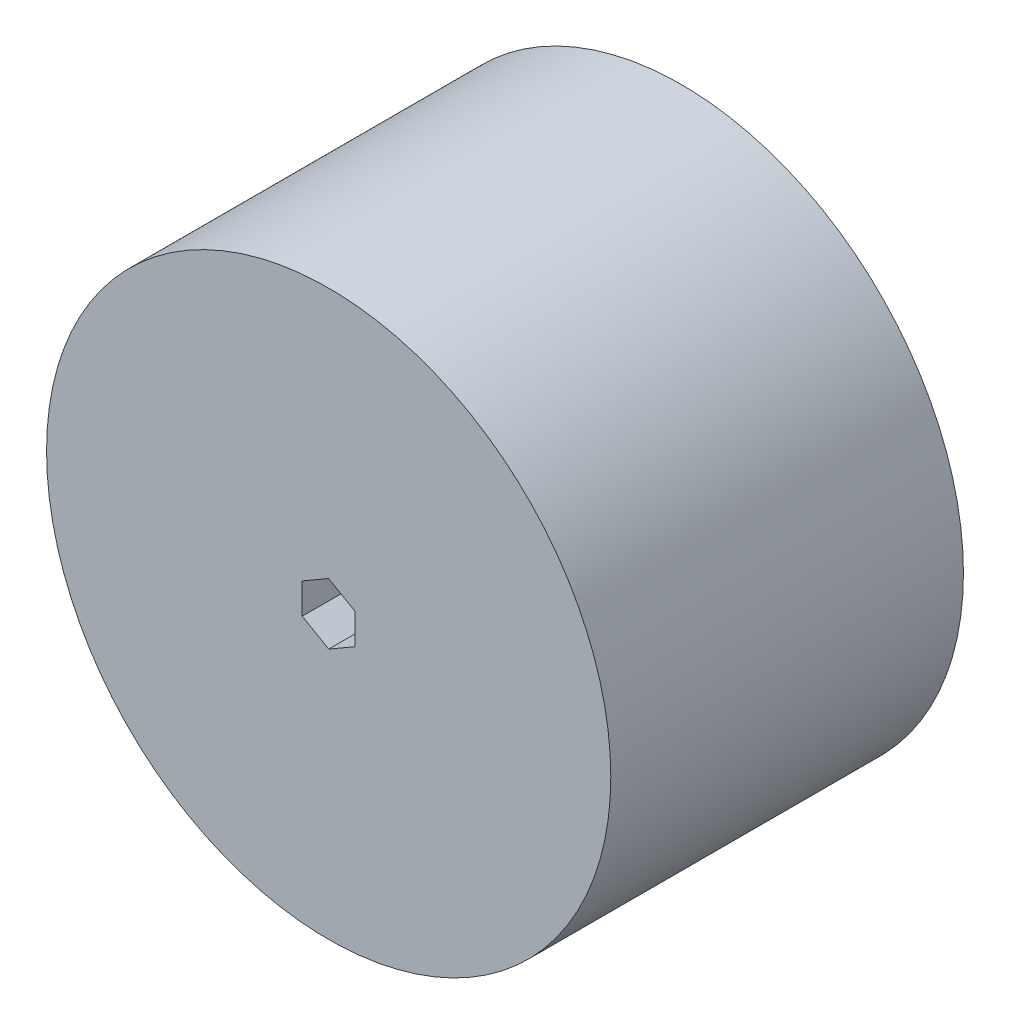
ISO-10303-21;
HEADER;
FILE_DESCRIPTION(('STEP AP214'),'2;1');
FILE_NAME('part.step','',(''),(''),'','','');
FILE_SCHEMA(('AUTOMOTIVE_DESIGN { 1 0 10303 214 1 1 1 1 }'));
ENDSEC;
DATA;
#1=APPLICATION_CONTEXT('core data for automotive mechanical design processes');
#2=APPLICATION_PROTOCOL_DEFINITION('international standard','automotive_design',2000,#1);
#3=PRODUCT_CONTEXT('',#1,'mechanical');
#4=PRODUCT('Part','Part','',(#3));
#5=PRODUCT_RELATED_PRODUCT_CATEGORY('part','',(#4));
#6=PRODUCT_DEFINITION_FORMATION('','',#4);
#7=PRODUCT_DEFINITION_CONTEXT('part definition',#1,'design');
#8=PRODUCT_DEFINITION('design','',#6,#7);
#9=PRODUCT_DEFINITION_SHAPE('','',#8);
#10=(LENGTH_UNIT() NAMED_UNIT(*) SI_UNIT(.MILLI.,.METRE.));
#11=(NAMED_UNIT(*) PLANE_ANGLE_UNIT() SI_UNIT($,.RADIAN.));
#12=(NAMED_UNIT(*) SI_UNIT($,.STERADIAN.) SOLID_ANGLE_UNIT());
#13=UNCERTAINTY_MEASURE_WITH_UNIT(LENGTH_MEASURE(1.E-05),#10,'distance_accuracy_value','');
#14=(GEOMETRIC_REPRESENTATION_CONTEXT(3) GLOBAL_UNCERTAINTY_ASSIGNED_CONTEXT((#13)) GLOBAL_UNIT_ASSIGNED_CONTEXT((#10,
#11,#12)) REPRESENTATION_CONTEXT('',''));
#15=CARTESIAN_POINT('',(0.,0.,0.));
#16=DIRECTION('',(0.,0.,1.));
#17=DIRECTION('',(1.,0.,0.));
#18=AXIS2_PLACEMENT_3D('',#15,#16,#17);
#19=CARTESIAN_POINT('',(0.,0.,63.5));
#20=DIRECTION('',(0.,0.,1.));
#21=DIRECTION('',(1.,0.,0.));
#22=AXIS2_PLACEMENT_3D('',#19,#20,#21);
#23=PLANE('',#22);
#24=CARTESIAN_POINT('',(0.,0.,63.5));
#25=DIRECTION('',(0.,0.,1.));
#26=DIRECTION('',(1.,0.,0.));
#27=AXIS2_PLACEMENT_3D('',#24,#25,#26);
#28=CIRCLE('',#27,50.8);
#29=CARTESIAN_POINT('',(50.8,0.,63.5));
#30=VERTEX_POINT('',#29);
#31=EDGE_CURVE('E11',#30,#30,#28,.T.);
#32=ORIENTED_EDGE('',*,*,#31,.T.);
#33=EDGE_LOOP('',(#32));
#34=FACE_BOUND('',#33,.T.);
#35=DIRECTION('',(-0.866430343299061,0.499297967360845,0.));
#36=VECTOR('',#35,1.);
#37=CARTESIAN_POINT('',(4.76027000365967,2.75348951192083,63.5));
#38=LINE('',#37,#36);
#39=CARTESIAN_POINT('',(4.76027000365967,2.75348951192083,63.5));
#40=VERTEX_POINT('',#39);
#41=CARTESIAN_POINT('',(-0.0044568645476161,5.49925950800273,63.5));
#42=VERTEX_POINT('',#41);
#43=EDGE_CURVE('E93',#40,#42,#38,.T.);
#44=ORIENTED_EDGE('',*,*,#43,.F.);
#45=DIRECTION('',(-0.000810447857105078,0.999999671587082,0.));
#46=VECTOR('',#45,1.);
#47=CARTESIAN_POINT('',(4.76472686820729,-2.7457699960819,63.5));
#48=LINE('',#47,#46);
#49=CARTESIAN_POINT('',(4.76472686820729,-2.7457699960819,63.5));
#50=VERTEX_POINT('',#49);
#51=EDGE_CURVE('E85',#50,#40,#48,.T.);
#52=ORIENTED_EDGE('',*,*,#51,.F.);
#53=DIRECTION('',(0.865619895441955,0.500701704226237,0.));
#54=VECTOR('',#53,1.);
#55=CARTESIAN_POINT('',(0.00445686454762432,-5.49925950800273,63.5));
#56=LINE('',#55,#54);
#57=CARTESIAN_POINT('',(0.00445686454762437,-5.49925950800273,63.5));
#58=VERTEX_POINT('',#57);
#59=EDGE_CURVE('E113',#58,#50,#56,.T.);
#60=ORIENTED_EDGE('',*,*,#59,.F.);
#61=DIRECTION('',(0.866430343299061,-0.499297967360845,0.));
#62=VECTOR('',#61,1.);
#63=CARTESIAN_POINT('',(-4.76027000365966,-2.75348951192083,63.5));
#64=LINE('',#63,#62);
#65=CARTESIAN_POINT('',(-4.76027000365966,-2.75348951192083,63.5));
#66=VERTEX_POINT('',#65);
#67=EDGE_CURVE('E111',#66,#58,#64,.T.);
#68=ORIENTED_EDGE('',*,*,#67,.F.);
#69=DIRECTION('',(0.000810447857105393,-0.999999671587081,0.));
#70=VECTOR('',#69,1.);
#71=CARTESIAN_POINT('',(-4.76472686820728,2.7457699960819,63.5));
#72=LINE('',#71,#70);
#73=CARTESIAN_POINT('',(-4.76472686820728,2.7457699960819,63.5));
#74=VERTEX_POINT('',#73);
#75=EDGE_CURVE('E107',#74,#66,#72,.T.);
#76=ORIENTED_EDGE('',*,*,#75,.F.);
#77=DIRECTION('',(-0.865619895441956,-0.500701704226237,0.));
#78=VECTOR('',#77,1.);
#79=CARTESIAN_POINT('',(-0.0044568645476161,5.49925950800273,63.5));
#80=LINE('',#79,#78);
#81=EDGE_CURVE('E105',#42,#74,#80,.T.);
#82=ORIENTED_EDGE('',*,*,#81,.F.);
#83=EDGE_LOOP('',(#44,#52,#60,#68,#76,#82));
#84=FACE_BOUND('',#83,.T.);
#85=ADVANCED_FACE('F32',(#34,#84),#23,.T.);
#86=CARTESIAN_POINT('',(0.,0.,0.));
#87=DIRECTION('',(0.,0.,1.));
#88=DIRECTION('',(1.,0.,0.));
#89=AXIS2_PLACEMENT_3D('',#86,#87,#88);
#90=PLANE('',#89);
#91=CARTESIAN_POINT('',(0.,0.,0.));
#92=DIRECTION('',(0.,0.,1.));
#93=DIRECTION('',(1.,0.,0.));
#94=AXIS2_PLACEMENT_3D('',#91,#92,#93);
#95=CIRCLE('',#94,50.8);
#96=CARTESIAN_POINT('',(50.8,0.,0.));
#97=VERTEX_POINT('',#96);
#98=EDGE_CURVE('E36',#97,#97,#95,.T.);
#99=ORIENTED_EDGE('',*,*,#98,.F.);
#100=EDGE_LOOP('',(#99));
#101=FACE_BOUND('',#100,.T.);
#102=DIRECTION('',(-0.000810447857105078,0.999999671587082,0.));
#103=VECTOR('',#102,1.);
#104=CARTESIAN_POINT('',(4.76472686820729,-2.7457699960819,0.));
#105=LINE('',#104,#103);
#106=CARTESIAN_POINT('',(4.76472686820729,-2.7457699960819,0.));
#107=VERTEX_POINT('',#106);
#108=CARTESIAN_POINT('',(4.76027000365967,2.75348951192083,0.));
#109=VERTEX_POINT('',#108);
#110=EDGE_CURVE('E55',#107,#109,#105,.T.);
#111=ORIENTED_EDGE('',*,*,#110,.T.);
#112=DIRECTION('',(-0.866430343299061,0.499297967360845,0.));
#113=VECTOR('',#112,1.);
#114=CARTESIAN_POINT('',(4.76027000365967,2.75348951192083,0.));
#115=LINE('',#114,#113);
#116=CARTESIAN_POINT('',(-0.0044568645476161,5.49925950800273,0.));
#117=VERTEX_POINT('',#116);
#118=EDGE_CURVE('E100',#109,#117,#115,.T.);
#119=ORIENTED_EDGE('',*,*,#118,.T.);
#120=DIRECTION('',(-0.865619895441956,-0.500701704226237,0.));
#121=VECTOR('',#120,1.);
#122=CARTESIAN_POINT('',(-0.0044568645476161,5.49925950800273,0.));
#123=LINE('',#122,#121);
#124=CARTESIAN_POINT('',(-4.76472686820728,2.7457699960819,0.));
#125=VERTEX_POINT('',#124);
#126=EDGE_CURVE('E117',#117,#125,#123,.T.);
#127=ORIENTED_EDGE('',*,*,#126,.T.);
#128=DIRECTION('',(0.000810447857105393,-0.999999671587081,0.));
#129=VECTOR('',#128,1.);
#130=CARTESIAN_POINT('',(-4.76472686820728,2.7457699960819,0.));
#131=LINE('',#130,#129);
#132=CARTESIAN_POINT('',(-4.76027000365966,-2.75348951192083,0.));
#133=VERTEX_POINT('',#132);
#134=EDGE_CURVE('E120',#125,#133,#131,.T.);
#135=ORIENTED_EDGE('',*,*,#134,.T.);
#136=DIRECTION('',(0.866430343299061,-0.499297967360845,0.));
#137=VECTOR('',#136,1.);
#138=CARTESIAN_POINT('',(-4.76027000365966,-2.75348951192083,0.));
#139=LINE('',#138,#137);
#140=CARTESIAN_POINT('',(0.00445686454762432,-5.49925950800273,0.));
#141=VERTEX_POINT('',#140);
#142=EDGE_CURVE('E123',#133,#141,#139,.T.);
#143=ORIENTED_EDGE('',*,*,#142,.T.);
#144=DIRECTION('',(0.865619895441955,0.500701704226237,0.));
#145=VECTOR('',#144,1.);
#146=CARTESIAN_POINT('',(0.00445686454762432,-5.49925950800273,0.));
#147=LINE('',#146,#145);
#148=EDGE_CURVE('E94',#141,#107,#147,.T.);
#149=ORIENTED_EDGE('',*,*,#148,.T.);
#150=EDGE_LOOP('',(#111,#119,#127,#135,#143,#149));
#151=FACE_BOUND('',#150,.T.);
#152=ADVANCED_FACE('F140',(#101,#151),#90,.F.);
#153=CARTESIAN_POINT('',(0.,0.,63.5));
#154=DIRECTION('',(0.,0.,-1.));
#155=DIRECTION('',(-1.,0.,0.));
#156=AXIS2_PLACEMENT_3D('',#153,#154,#155);
#157=CYLINDRICAL_SURFACE('',#156,50.8);
#158=ORIENTED_EDGE('',*,*,#31,.F.);
#159=EDGE_LOOP('',(#158));
#160=FACE_BOUND('',#159,.T.);
#161=ORIENTED_EDGE('',*,*,#98,.T.);
#162=EDGE_LOOP('',(#161));
#163=FACE_BOUND('',#162,.T.);
#164=ADVANCED_FACE('F34',(#160,#163),#157,.T.);
#165=CARTESIAN_POINT('',(4.76472686820729,-2.7457699960819,63.5));
#166=DIRECTION('',(-0.999999671587082,-0.000810447857105078,0.));
#167=DIRECTION('',(0.000810447857105078,-0.999999671587082,0.));
#168=AXIS2_PLACEMENT_3D('',#165,#166,#167);
#169=PLANE('',#168);
#170=ORIENTED_EDGE('',*,*,#110,.F.);
#171=DIRECTION('',(0.,0.,-1.));
#172=VECTOR('',#171,1.);
#173=CARTESIAN_POINT('',(4.76472686820729,-2.7457699960819,63.5));
#174=LINE('',#173,#172);
#175=EDGE_CURVE('E89',#50,#107,#174,.T.);
#176=ORIENTED_EDGE('',*,*,#175,.F.);
#177=ORIENTED_EDGE('',*,*,#51,.T.);
#178=DIRECTION('',(0.,0.,-1.));
#179=VECTOR('',#178,1.);
#180=CARTESIAN_POINT('',(4.76027000365967,2.75348951192083,63.5));
#181=LINE('',#180,#179);
#182=EDGE_CURVE('E88',#40,#109,#181,.T.);
#183=ORIENTED_EDGE('',*,*,#182,.T.);
#184=EDGE_LOOP('',(#170,#176,#177,#183));
#185=FACE_BOUND('',#184,.T.);
#186=ADVANCED_FACE('F87',(#185),#169,.T.);
#187=CARTESIAN_POINT('',(4.76027000365967,2.75348951192083,63.5));
#188=DIRECTION('',(-0.499297967360845,-0.866430343299061,0.));
#189=DIRECTION('',(0.866430343299061,-0.499297967360845,0.));
#190=AXIS2_PLACEMENT_3D('',#187,#188,#189);
#191=PLANE('',#190);
#192=ORIENTED_EDGE('',*,*,#118,.F.);
#193=ORIENTED_EDGE('',*,*,#182,.F.);
#194=ORIENTED_EDGE('',*,*,#43,.T.);
#195=DIRECTION('',(0.,0.,-1.));
#196=VECTOR('',#195,1.);
#197=CARTESIAN_POINT('',(-0.0044568645476161,5.49925950800273,63.5));
#198=LINE('',#197,#196);
#199=EDGE_CURVE('E101',#42,#117,#198,.T.);
#200=ORIENTED_EDGE('',*,*,#199,.T.);
#201=EDGE_LOOP('',(#192,#193,#194,#200));
#202=FACE_BOUND('',#201,.T.);
#203=ADVANCED_FACE('F97',(#202),#191,.T.);
#204=CARTESIAN_POINT('',(-0.0044568645476161,5.49925950800273,63.5));
#205=DIRECTION('',(0.500701704226237,-0.865619895441956,0.));
#206=DIRECTION('',(0.865619895441956,0.500701704226237,0.));
#207=AXIS2_PLACEMENT_3D('',#204,#205,#206);
#208=PLANE('',#207);
#209=ORIENTED_EDGE('',*,*,#126,.F.);
#210=ORIENTED_EDGE('',*,*,#199,.F.);
#211=ORIENTED_EDGE('',*,*,#81,.T.);
#212=DIRECTION('',(0.,0.,-1.));
#213=VECTOR('',#212,1.);
#214=CARTESIAN_POINT('',(-4.76472686820728,2.7457699960819,63.5));
#215=LINE('',#214,#213);
#216=EDGE_CURVE('E132',#74,#125,#215,.T.);
#217=ORIENTED_EDGE('',*,*,#216,.T.);
#218=EDGE_LOOP('',(#209,#210,#211,#217));
#219=FACE_BOUND('',#218,.T.);
#220=ADVANCED_FACE('F136',(#219),#208,.T.);
#221=CARTESIAN_POINT('',(-4.76472686820728,2.7457699960819,63.5));
#222=DIRECTION('',(0.999999671587082,0.000810447857105393,0.));
#223=DIRECTION('',(-0.000810447857105393,0.999999671587082,0.));
#224=AXIS2_PLACEMENT_3D('',#221,#222,#223);
#225=PLANE('',#224);
#226=ORIENTED_EDGE('',*,*,#134,.F.);
#227=ORIENTED_EDGE('',*,*,#216,.F.);
#228=ORIENTED_EDGE('',*,*,#75,.T.);
#229=DIRECTION('',(0.,0.,-1.));
#230=VECTOR('',#229,1.);
#231=CARTESIAN_POINT('',(-4.76027000365966,-2.75348951192083,63.5));
#232=LINE('',#231,#230);
#233=EDGE_CURVE('E130',#66,#133,#232,.T.);
#234=ORIENTED_EDGE('',*,*,#233,.T.);
#235=EDGE_LOOP('',(#226,#227,#228,#234));
#236=FACE_BOUND('',#235,.T.);
#237=ADVANCED_FACE('F148',(#236),#225,.T.);
#238=CARTESIAN_POINT('',(-4.76027000365966,-2.75348951192083,63.5));
#239=DIRECTION('',(0.499297967360845,0.866430343299061,0.));
#240=DIRECTION('',(-0.866430343299061,0.499297967360845,0.));
#241=AXIS2_PLACEMENT_3D('',#238,#239,#240);
#242=PLANE('',#241);
#243=ORIENTED_EDGE('',*,*,#142,.F.);
#244=ORIENTED_EDGE('',*,*,#233,.F.);
#245=ORIENTED_EDGE('',*,*,#67,.T.);
#246=DIRECTION('',(0.,0.,-1.));
#247=VECTOR('',#246,1.);
#248=CARTESIAN_POINT('',(0.00445686454762432,-5.49925950800273,63.5));
#249=LINE('',#248,#247);
#250=EDGE_CURVE('E47',#58,#141,#249,.T.);
#251=ORIENTED_EDGE('',*,*,#250,.T.);
#252=EDGE_LOOP('',(#243,#244,#245,#251));
#253=FACE_BOUND('',#252,.T.);
#254=ADVANCED_FACE('F146',(#253),#242,.T.);
#255=CARTESIAN_POINT('',(0.00445686454762432,-5.49925950800273,63.5));
#256=DIRECTION('',(-0.500701704226237,0.865619895441955,0.));
#257=DIRECTION('',(-0.865619895441955,-0.500701704226237,0.));
#258=AXIS2_PLACEMENT_3D('',#255,#256,#257);
#259=PLANE('',#258);
#260=ORIENTED_EDGE('',*,*,#148,.F.);
#261=ORIENTED_EDGE('',*,*,#250,.F.);
#262=ORIENTED_EDGE('',*,*,#59,.T.);
#263=ORIENTED_EDGE('',*,*,#175,.T.);
#264=EDGE_LOOP('',(#260,#261,#262,#263));
#265=FACE_BOUND('',#264,.T.);
#266=ADVANCED_FACE('F142',(#265),#259,.T.);
#267=CLOSED_SHELL('',(#85,#152,#164,#186,#203,#220,#237,#254,#266));
#268=MANIFOLD_SOLID_BREP('B2',#267);
#269=ADVANCED_BREP_SHAPE_REPRESENTATION('',(#18,#268),#14);
#270=SHAPE_DEFINITION_REPRESENTATION(#9,#269);
ENDSEC;
END-ISO-10303-21;
